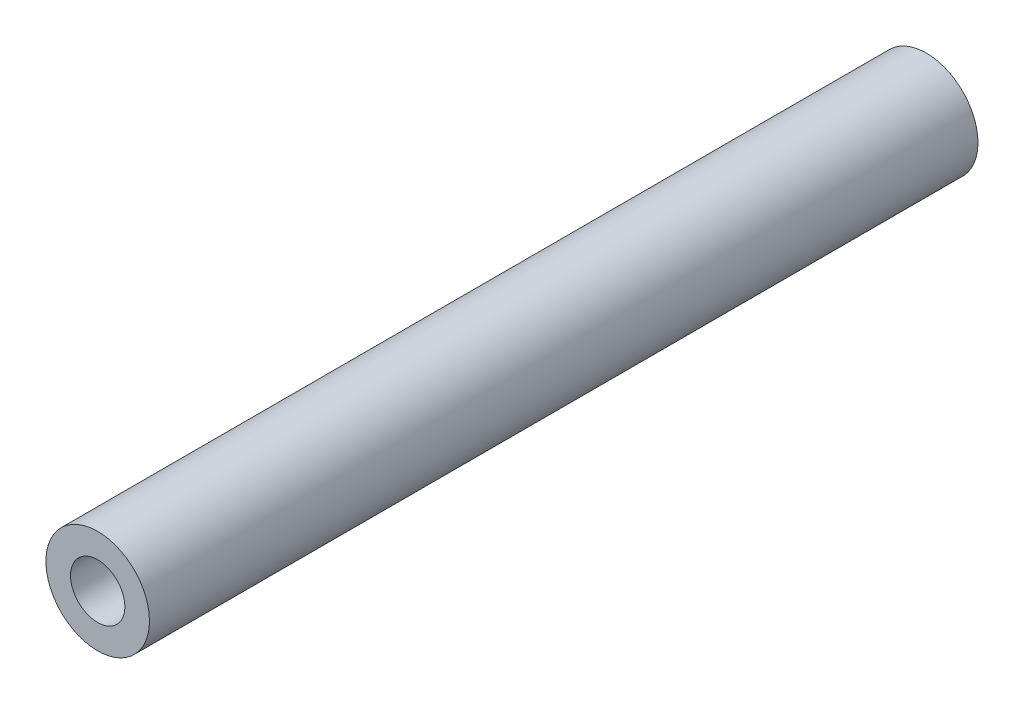
ISO-10303-21;
HEADER;
FILE_DESCRIPTION(('STEP AP214'),'2;1');
FILE_NAME('part.step','',(''),(''),'','','');
FILE_SCHEMA(('AUTOMOTIVE_DESIGN { 1 0 10303 214 1 1 1 1 }'));
ENDSEC;
DATA;
#1=APPLICATION_CONTEXT('core data for automotive mechanical design processes');
#2=APPLICATION_PROTOCOL_DEFINITION('international standard','automotive_design',2000,#1);
#3=PRODUCT_CONTEXT('',#1,'mechanical');
#4=PRODUCT('Part','Part','',(#3));
#5=PRODUCT_RELATED_PRODUCT_CATEGORY('part','',(#4));
#6=PRODUCT_DEFINITION_FORMATION('','',#4);
#7=PRODUCT_DEFINITION_CONTEXT('part definition',#1,'design');
#8=PRODUCT_DEFINITION('design','',#6,#7);
#9=PRODUCT_DEFINITION_SHAPE('','',#8);
#10=(LENGTH_UNIT() NAMED_UNIT(*) SI_UNIT(.MILLI.,.METRE.));
#11=(NAMED_UNIT(*) PLANE_ANGLE_UNIT() SI_UNIT($,.RADIAN.));
#12=(NAMED_UNIT(*) SI_UNIT($,.STERADIAN.) SOLID_ANGLE_UNIT());
#13=UNCERTAINTY_MEASURE_WITH_UNIT(LENGTH_MEASURE(1.E-05),#10,'distance_accuracy_value','');
#14=(GEOMETRIC_REPRESENTATION_CONTEXT(3) GLOBAL_UNCERTAINTY_ASSIGNED_CONTEXT((#13)) GLOBAL_UNIT_ASSIGNED_CONTEXT((#10,
#11,#12)) REPRESENTATION_CONTEXT('',''));
#15=CARTESIAN_POINT('',(0.,0.,0.));
#16=DIRECTION('',(0.,0.,1.));
#17=DIRECTION('',(1.,0.,0.));
#18=AXIS2_PLACEMENT_3D('',#15,#16,#17);
#19=CARTESIAN_POINT('',(0.,0.,64.));
#20=DIRECTION('',(0.,0.,1.));
#21=DIRECTION('',(1.,0.,0.));
#22=AXIS2_PLACEMENT_3D('',#19,#20,#21);
#23=PLANE('',#22);
#24=CARTESIAN_POINT('',(0.,0.,64.));
#25=DIRECTION('',(0.,0.,1.));
#26=DIRECTION('',(1.,0.,0.));
#27=AXIS2_PLACEMENT_3D('',#24,#25,#26);
#28=CIRCLE('',#27,4.);
#29=CARTESIAN_POINT('',(4.,0.,64.));
#30=VERTEX_POINT('',#29);
#31=EDGE_CURVE('E10',#30,#30,#28,.T.);
#32=ORIENTED_EDGE('',*,*,#31,.T.);
#33=EDGE_LOOP('',(#32));
#34=FACE_BOUND('',#33,.T.);
#35=CARTESIAN_POINT('',(0.,0.,64.));
#36=DIRECTION('',(0.,0.,1.));
#37=DIRECTION('',(1.,0.,0.));
#38=AXIS2_PLACEMENT_3D('',#35,#36,#37);
#39=CIRCLE('',#38,2.1);
#40=CARTESIAN_POINT('',(2.1,0.,64.));
#41=VERTEX_POINT('',#40);
#42=EDGE_CURVE('E42',#41,#41,#39,.T.);
#43=ORIENTED_EDGE('',*,*,#42,.F.);
#44=EDGE_LOOP('',(#43));
#45=FACE_BOUND('',#44,.T.);
#46=ADVANCED_FACE('F31',(#34,#45),#23,.T.);
#47=CARTESIAN_POINT('',(0.,0.,0.));
#48=DIRECTION('',(0.,0.,1.));
#49=DIRECTION('',(1.,0.,0.));
#50=AXIS2_PLACEMENT_3D('',#47,#48,#49);
#51=PLANE('',#50);
#52=CARTESIAN_POINT('',(0.,0.,0.));
#53=DIRECTION('',(0.,0.,1.));
#54=DIRECTION('',(1.,0.,0.));
#55=AXIS2_PLACEMENT_3D('',#52,#53,#54);
#56=CIRCLE('',#55,4.);
#57=CARTESIAN_POINT('',(4.,0.,0.));
#58=VERTEX_POINT('',#57);
#59=EDGE_CURVE('E35',#58,#58,#56,.T.);
#60=ORIENTED_EDGE('',*,*,#59,.F.);
#61=EDGE_LOOP('',(#60));
#62=FACE_BOUND('',#61,.T.);
#63=CARTESIAN_POINT('',(0.,0.,0.));
#64=DIRECTION('',(0.,0.,1.));
#65=DIRECTION('',(1.,0.,0.));
#66=AXIS2_PLACEMENT_3D('',#63,#64,#65);
#67=CIRCLE('',#66,2.1);
#68=CARTESIAN_POINT('',(2.1,0.,0.));
#69=VERTEX_POINT('',#68);
#70=EDGE_CURVE('E44',#69,#69,#67,.T.);
#71=ORIENTED_EDGE('',*,*,#70,.T.);
#72=EDGE_LOOP('',(#71));
#73=FACE_BOUND('',#72,.T.);
#74=ADVANCED_FACE('F54',(#62,#73),#51,.F.);
#75=CARTESIAN_POINT('',(0.,0.,64.));
#76=DIRECTION('',(0.,0.,-1.));
#77=DIRECTION('',(-1.,0.,0.));
#78=AXIS2_PLACEMENT_3D('',#75,#76,#77);
#79=CYLINDRICAL_SURFACE('',#78,4.);
#80=ORIENTED_EDGE('',*,*,#31,.F.);
#81=EDGE_LOOP('',(#80));
#82=FACE_BOUND('',#81,.T.);
#83=ORIENTED_EDGE('',*,*,#59,.T.);
#84=EDGE_LOOP('',(#83));
#85=FACE_BOUND('',#84,.T.);
#86=ADVANCED_FACE('F33',(#82,#85),#79,.T.);
#87=CARTESIAN_POINT('',(0.,0.,64.));
#88=DIRECTION('',(0.,0.,-1.));
#89=DIRECTION('',(-1.,0.,0.));
#90=AXIS2_PLACEMENT_3D('',#87,#88,#89);
#91=CYLINDRICAL_SURFACE('',#90,2.1);
#92=ORIENTED_EDGE('',*,*,#42,.T.);
#93=EDGE_LOOP('',(#92));
#94=FACE_BOUND('',#93,.T.);
#95=ORIENTED_EDGE('',*,*,#70,.F.);
#96=EDGE_LOOP('',(#95));
#97=FACE_BOUND('',#96,.T.);
#98=ADVANCED_FACE('F50',(#94,#97),#91,.F.);
#99=CLOSED_SHELL('',(#46,#74,#86,#98));
#100=MANIFOLD_SOLID_BREP('B2',#99);
#101=ADVANCED_BREP_SHAPE_REPRESENTATION('',(#18,#100),#14);
#102=SHAPE_DEFINITION_REPRESENTATION(#9,#101);
ENDSEC;
END-ISO-10303-21;
